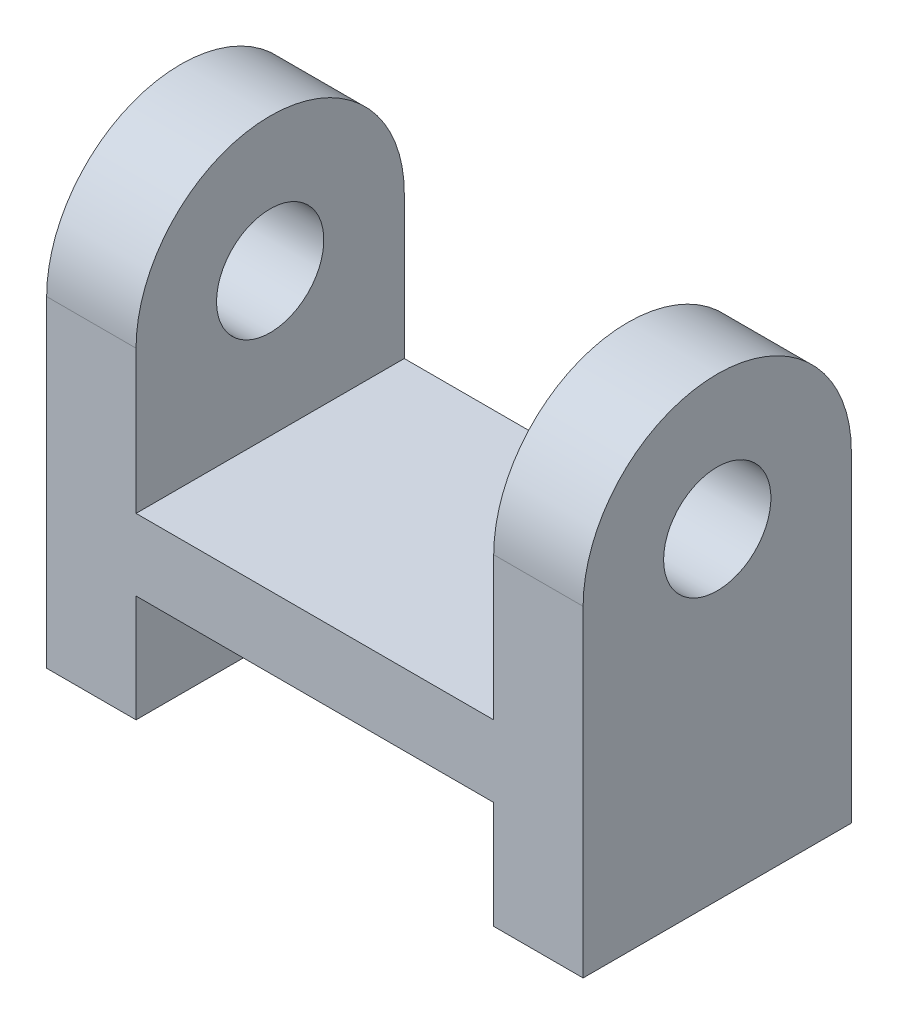
ISO-10303-21;
HEADER;
FILE_DESCRIPTION(('STEP AP214'),'2;1');
FILE_NAME('part.step','',(''),(''),'','','');
FILE_SCHEMA(('AUTOMOTIVE_DESIGN { 1 0 10303 214 1 1 1 1 }'));
ENDSEC;
DATA;
#1=APPLICATION_CONTEXT('core data for automotive mechanical design processes');
#2=APPLICATION_PROTOCOL_DEFINITION('international standard','automotive_design',2000,#1);
#3=PRODUCT_CONTEXT('',#1,'mechanical');
#4=PRODUCT('Part','Part','',(#3));
#5=PRODUCT_RELATED_PRODUCT_CATEGORY('part','',(#4));
#6=PRODUCT_DEFINITION_FORMATION('','',#4);
#7=PRODUCT_DEFINITION_CONTEXT('part definition',#1,'design');
#8=PRODUCT_DEFINITION('design','',#6,#7);
#9=PRODUCT_DEFINITION_SHAPE('','',#8);
#10=(LENGTH_UNIT() NAMED_UNIT(*) SI_UNIT(.MILLI.,.METRE.));
#11=(NAMED_UNIT(*) PLANE_ANGLE_UNIT() SI_UNIT($,.RADIAN.));
#12=(NAMED_UNIT(*) SI_UNIT($,.STERADIAN.) SOLID_ANGLE_UNIT());
#13=UNCERTAINTY_MEASURE_WITH_UNIT(LENGTH_MEASURE(1.E-05),#10,'distance_accuracy_value','');
#14=(GEOMETRIC_REPRESENTATION_CONTEXT(3) GLOBAL_UNCERTAINTY_ASSIGNED_CONTEXT((#13)) GLOBAL_UNIT_ASSIGNED_CONTEXT((#10,
#11,#12)) REPRESENTATION_CONTEXT('',''));
#15=CARTESIAN_POINT('',(0.,0.,0.));
#16=DIRECTION('',(0.,0.,1.));
#17=DIRECTION('',(1.,0.,0.));
#18=AXIS2_PLACEMENT_3D('',#15,#16,#17);
#19=CARTESIAN_POINT('',(10.,0.,15.));
#20=DIRECTION('',(0.,1.,0.));
#21=DIRECTION('',(-1.,0.,0.));
#22=AXIS2_PLACEMENT_3D('',#19,#20,#21);
#23=PLANE('',#22);
#24=DIRECTION('',(1.,0.,0.));
#25=VECTOR('',#24,1.);
#26=CARTESIAN_POINT('',(10.,0.,0.));
#27=LINE('',#26,#25);
#28=CARTESIAN_POINT('',(10.,0.,0.));
#29=VERTEX_POINT('',#28);
#30=CARTESIAN_POINT('',(15.,0.,0.));
#31=VERTEX_POINT('',#30);
#32=EDGE_CURVE('E201',#29,#31,#27,.T.);
#33=ORIENTED_EDGE('',*,*,#32,.T.);
#34=DIRECTION('',(0.,0.,-1.));
#35=VECTOR('',#34,1.);
#36=CARTESIAN_POINT('',(15.,0.,15.));
#37=LINE('',#36,#35);
#38=CARTESIAN_POINT('',(15.,0.,15.));
#39=VERTEX_POINT('',#38);
#40=EDGE_CURVE('E11',#39,#31,#37,.T.);
#41=ORIENTED_EDGE('',*,*,#40,.F.);
#42=DIRECTION('',(1.,0.,0.));
#43=VECTOR('',#42,1.);
#44=CARTESIAN_POINT('',(10.,0.,15.));
#45=LINE('',#44,#43);
#46=CARTESIAN_POINT('',(10.,0.,15.));
#47=VERTEX_POINT('',#46);
#48=EDGE_CURVE('E205',#47,#39,#45,.T.);
#49=ORIENTED_EDGE('',*,*,#48,.F.);
#50=DIRECTION('',(0.,0.,-1.));
#51=VECTOR('',#50,1.);
#52=CARTESIAN_POINT('',(10.,0.,15.));
#53=LINE('',#52,#51);
#54=EDGE_CURVE('E230',#47,#29,#53,.T.);
#55=ORIENTED_EDGE('',*,*,#54,.T.);
#56=EDGE_LOOP('',(#33,#41,#49,#55));
#57=FACE_BOUND('',#56,.T.);
#58=ADVANCED_FACE('F39',(#57),#23,.F.);
#59=CARTESIAN_POINT('',(15.,0.,15.));
#60=DIRECTION('',(-1.,0.,0.));
#61=DIRECTION('',(0.,0.,1.));
#62=AXIS2_PLACEMENT_3D('',#59,#60,#61);
#63=PLANE('',#62);
#64=CARTESIAN_POINT('',(15.,18.,7.5));
#65=DIRECTION('',(-1.,0.,0.));
#66=DIRECTION('',(0.,0.,1.));
#67=AXIS2_PLACEMENT_3D('',#64,#65,#66);
#68=CIRCLE('',#67,3.);
#69=CARTESIAN_POINT('',(15.,18.,10.5));
#70=VERTEX_POINT('',#69);
#71=EDGE_CURVE('E336',#70,#70,#68,.T.);
#72=ORIENTED_EDGE('',*,*,#71,.T.);
#73=EDGE_LOOP('',(#72));
#74=FACE_BOUND('',#73,.T.);
#75=DIRECTION('',(0.,1.,0.));
#76=VECTOR('',#75,1.);
#77=CARTESIAN_POINT('',(15.,0.,0.));
#78=LINE('',#77,#76);
#79=CARTESIAN_POINT('',(15.,18.,0.));
#80=VERTEX_POINT('',#79);
#81=EDGE_CURVE('E139',#31,#80,#78,.T.);
#82=ORIENTED_EDGE('',*,*,#81,.T.);
#83=CARTESIAN_POINT('',(15.,18.,7.5));
#84=DIRECTION('',(-1.,0.,0.));
#85=DIRECTION('',(0.,0.,-1.));
#86=AXIS2_PLACEMENT_3D('',#83,#84,#85);
#87=CIRCLE('',#86,7.5);
#88=CARTESIAN_POINT('',(15.,18.,15.));
#89=VERTEX_POINT('',#88);
#90=EDGE_CURVE('E146',#89,#80,#87,.T.);
#91=ORIENTED_EDGE('',*,*,#90,.F.);
#92=DIRECTION('',(0.,1.,0.));
#93=VECTOR('',#92,1.);
#94=CARTESIAN_POINT('',(15.,0.,15.));
#95=LINE('',#94,#93);
#96=EDGE_CURVE('E209',#39,#89,#95,.T.);
#97=ORIENTED_EDGE('',*,*,#96,.F.);
#98=ORIENTED_EDGE('',*,*,#40,.T.);
#99=EDGE_LOOP('',(#82,#91,#97,#98));
#100=FACE_BOUND('',#99,.T.);
#101=ADVANCED_FACE('F306',(#74,#100),#63,.F.);
#102=CARTESIAN_POINT('',(-15.,10.,15.));
#103=DIRECTION('',(0.,-1.,0.));
#104=DIRECTION('',(0.,0.,-1.));
#105=AXIS2_PLACEMENT_3D('',#102,#103,#104);
#106=PLANE('',#105);
#107=DIRECTION('',(-1.,0.,0.));
#108=VECTOR('',#107,1.);
#109=CARTESIAN_POINT('',(-15.,10.,15.));
#110=LINE('',#109,#108);
#111=CARTESIAN_POINT('',(9.99999999999999,10.,15.));
#112=VERTEX_POINT('',#111);
#113=CARTESIAN_POINT('',(-10.,10.,15.));
#114=VERTEX_POINT('',#113);
#115=EDGE_CURVE('E54',#112,#114,#110,.T.);
#116=ORIENTED_EDGE('',*,*,#115,.F.);
#117=DIRECTION('',(0.,0.,1.));
#118=VECTOR('',#117,1.);
#119=CARTESIAN_POINT('',(9.99999999999999,10.,0.));
#120=LINE('',#119,#118);
#121=CARTESIAN_POINT('',(9.99999999999999,10.,0.));
#122=VERTEX_POINT('',#121);
#123=EDGE_CURVE('E142',#122,#112,#120,.T.);
#124=ORIENTED_EDGE('',*,*,#123,.F.);
#125=DIRECTION('',(-1.,0.,0.));
#126=VECTOR('',#125,1.);
#127=CARTESIAN_POINT('',(-15.,10.,0.));
#128=LINE('',#127,#126);
#129=CARTESIAN_POINT('',(-10.,10.,0.));
#130=VERTEX_POINT('',#129);
#131=EDGE_CURVE('E128',#122,#130,#128,.T.);
#132=ORIENTED_EDGE('',*,*,#131,.T.);
#133=DIRECTION('',(0.,0.,1.));
#134=VECTOR('',#133,1.);
#135=CARTESIAN_POINT('',(-10.,10.,0.));
#136=LINE('',#135,#134);
#137=EDGE_CURVE('E181',#130,#114,#136,.T.);
#138=ORIENTED_EDGE('',*,*,#137,.T.);
#139=EDGE_LOOP('',(#116,#124,#132,#138));
#140=FACE_BOUND('',#139,.T.);
#141=ADVANCED_FACE('F143',(#140),#106,.F.);
#142=CARTESIAN_POINT('',(-15.,0.,15.));
#143=DIRECTION('',(1.,0.,0.));
#144=DIRECTION('',(0.,0.,-1.));
#145=AXIS2_PLACEMENT_3D('',#142,#143,#144);
#146=PLANE('',#145);
#147=CARTESIAN_POINT('',(-15.,18.,7.5));
#148=DIRECTION('',(-1.,0.,0.));
#149=DIRECTION('',(0.,0.,1.));
#150=AXIS2_PLACEMENT_3D('',#147,#148,#149);
#151=CIRCLE('',#150,3.);
#152=CARTESIAN_POINT('',(-15.,18.,10.5));
#153=VERTEX_POINT('',#152);
#154=EDGE_CURVE('E170',#153,#153,#151,.T.);
#155=ORIENTED_EDGE('',*,*,#154,.F.);
#156=EDGE_LOOP('',(#155));
#157=FACE_BOUND('',#156,.T.);
#158=DIRECTION('',(0.,-1.,0.));
#159=VECTOR('',#158,1.);
#160=CARTESIAN_POINT('',(-15.,0.,0.));
#161=LINE('',#160,#159);
#162=CARTESIAN_POINT('',(-15.,18.,0.));
#163=VERTEX_POINT('',#162);
#164=CARTESIAN_POINT('',(-15.,0.,0.));
#165=VERTEX_POINT('',#164);
#166=EDGE_CURVE('E138',#163,#165,#161,.T.);
#167=ORIENTED_EDGE('',*,*,#166,.T.);
#168=DIRECTION('',(0.,0.,-1.));
#169=VECTOR('',#168,1.);
#170=CARTESIAN_POINT('',(-15.,0.,15.));
#171=LINE('',#170,#169);
#172=CARTESIAN_POINT('',(-15.,0.,15.));
#173=VERTEX_POINT('',#172);
#174=EDGE_CURVE('E47',#173,#165,#171,.T.);
#175=ORIENTED_EDGE('',*,*,#174,.F.);
#176=DIRECTION('',(0.,-1.,0.));
#177=VECTOR('',#176,1.);
#178=CARTESIAN_POINT('',(-15.,0.,15.));
#179=LINE('',#178,#177);
#180=CARTESIAN_POINT('',(-15.,18.,15.));
#181=VERTEX_POINT('',#180);
#182=EDGE_CURVE('E215',#181,#173,#179,.T.);
#183=ORIENTED_EDGE('',*,*,#182,.F.);
#184=CARTESIAN_POINT('',(-15.,18.,7.5));
#185=DIRECTION('',(-1.,0.,0.));
#186=DIRECTION('',(0.,0.,-1.));
#187=AXIS2_PLACEMENT_3D('',#184,#185,#186);
#188=CIRCLE('',#187,7.5);
#189=EDGE_CURVE('E177',#181,#163,#188,.T.);
#190=ORIENTED_EDGE('',*,*,#189,.T.);
#191=EDGE_LOOP('',(#167,#175,#183,#190));
#192=FACE_BOUND('',#191,.T.);
#193=ADVANCED_FACE('F287',(#157,#192),#146,.F.);
#194=CARTESIAN_POINT('',(-10.,0.,15.));
#195=DIRECTION('',(0.,1.,0.));
#196=DIRECTION('',(-1.,0.,0.));
#197=AXIS2_PLACEMENT_3D('',#194,#195,#196);
#198=PLANE('',#197);
#199=DIRECTION('',(1.,0.,0.));
#200=VECTOR('',#199,1.);
#201=CARTESIAN_POINT('',(-10.,0.,0.));
#202=LINE('',#201,#200);
#203=CARTESIAN_POINT('',(-10.,0.,0.));
#204=VERTEX_POINT('',#203);
#205=EDGE_CURVE('E238',#165,#204,#202,.T.);
#206=ORIENTED_EDGE('',*,*,#205,.T.);
#207=DIRECTION('',(0.,0.,-1.));
#208=VECTOR('',#207,1.);
#209=CARTESIAN_POINT('',(-10.,0.,15.));
#210=LINE('',#209,#208);
#211=CARTESIAN_POINT('',(-10.,0.,15.));
#212=VERTEX_POINT('',#211);
#213=EDGE_CURVE('E260',#212,#204,#210,.T.);
#214=ORIENTED_EDGE('',*,*,#213,.F.);
#215=DIRECTION('',(1.,0.,0.));
#216=VECTOR('',#215,1.);
#217=CARTESIAN_POINT('',(-10.,0.,15.));
#218=LINE('',#217,#216);
#219=EDGE_CURVE('E218',#173,#212,#218,.T.);
#220=ORIENTED_EDGE('',*,*,#219,.F.);
#221=ORIENTED_EDGE('',*,*,#174,.T.);
#222=EDGE_LOOP('',(#206,#214,#220,#221));
#223=FACE_BOUND('',#222,.T.);
#224=ADVANCED_FACE('F269',(#223),#198,.F.);
#225=CARTESIAN_POINT('',(-10.,6.,15.));
#226=DIRECTION('',(-1.,0.,0.));
#227=DIRECTION('',(0.,0.,1.));
#228=AXIS2_PLACEMENT_3D('',#225,#226,#227);
#229=PLANE('',#228);
#230=DIRECTION('',(0.,1.,0.));
#231=VECTOR('',#230,1.);
#232=CARTESIAN_POINT('',(-10.,6.,0.));
#233=LINE('',#232,#231);
#234=CARTESIAN_POINT('',(-10.,6.,0.));
#235=VERTEX_POINT('',#234);
#236=EDGE_CURVE('E241',#204,#235,#233,.T.);
#237=ORIENTED_EDGE('',*,*,#236,.T.);
#238=DIRECTION('',(0.,0.,-1.));
#239=VECTOR('',#238,1.);
#240=CARTESIAN_POINT('',(-10.,6.,15.));
#241=LINE('',#240,#239);
#242=CARTESIAN_POINT('',(-10.,6.,15.));
#243=VERTEX_POINT('',#242);
#244=EDGE_CURVE('E256',#243,#235,#241,.T.);
#245=ORIENTED_EDGE('',*,*,#244,.F.);
#246=DIRECTION('',(0.,1.,0.));
#247=VECTOR('',#246,1.);
#248=CARTESIAN_POINT('',(-10.,6.,15.));
#249=LINE('',#248,#247);
#250=EDGE_CURVE('E221',#212,#243,#249,.T.);
#251=ORIENTED_EDGE('',*,*,#250,.F.);
#252=ORIENTED_EDGE('',*,*,#213,.T.);
#253=EDGE_LOOP('',(#237,#245,#251,#252));
#254=FACE_BOUND('',#253,.T.);
#255=ADVANCED_FACE('F277',(#254),#229,.F.);
#256=CARTESIAN_POINT('',(10.,6.,15.));
#257=DIRECTION('',(0.,1.,0.));
#258=DIRECTION('',(0.,0.,1.));
#259=AXIS2_PLACEMENT_3D('',#256,#257,#258);
#260=PLANE('',#259);
#261=DIRECTION('',(1.,0.,0.));
#262=VECTOR('',#261,1.);
#263=CARTESIAN_POINT('',(10.,6.,0.));
#264=LINE('',#263,#262);
#265=CARTESIAN_POINT('',(10.,6.,0.));
#266=VERTEX_POINT('',#265);
#267=EDGE_CURVE('E244',#235,#266,#264,.T.);
#268=ORIENTED_EDGE('',*,*,#267,.T.);
#269=DIRECTION('',(0.,0.,-1.));
#270=VECTOR('',#269,1.);
#271=CARTESIAN_POINT('',(10.,6.,15.));
#272=LINE('',#271,#270);
#273=CARTESIAN_POINT('',(10.,6.,15.));
#274=VERTEX_POINT('',#273);
#275=EDGE_CURVE('E252',#274,#266,#272,.T.);
#276=ORIENTED_EDGE('',*,*,#275,.F.);
#277=DIRECTION('',(1.,0.,0.));
#278=VECTOR('',#277,1.);
#279=CARTESIAN_POINT('',(10.,6.,15.));
#280=LINE('',#279,#278);
#281=EDGE_CURVE('E224',#243,#274,#280,.T.);
#282=ORIENTED_EDGE('',*,*,#281,.F.);
#283=ORIENTED_EDGE('',*,*,#244,.T.);
#284=EDGE_LOOP('',(#268,#276,#282,#283));
#285=FACE_BOUND('',#284,.T.);
#286=ADVANCED_FACE('F281',(#285),#260,.F.);
#287=CARTESIAN_POINT('',(10.,6.,15.));
#288=DIRECTION('',(1.,0.,0.));
#289=DIRECTION('',(0.,1.,0.));
#290=AXIS2_PLACEMENT_3D('',#287,#288,#289);
#291=PLANE('',#290);
#292=DIRECTION('',(0.,-1.,0.));
#293=VECTOR('',#292,1.);
#294=CARTESIAN_POINT('',(10.,6.,0.));
#295=LINE('',#294,#293);
#296=EDGE_CURVE('E210',#266,#29,#295,.T.);
#297=ORIENTED_EDGE('',*,*,#296,.T.);
#298=ORIENTED_EDGE('',*,*,#54,.F.);
#299=DIRECTION('',(0.,-1.,0.));
#300=VECTOR('',#299,1.);
#301=CARTESIAN_POINT('',(10.,6.,15.));
#302=LINE('',#301,#300);
#303=EDGE_CURVE('E227',#274,#47,#302,.T.);
#304=ORIENTED_EDGE('',*,*,#303,.F.);
#305=ORIENTED_EDGE('',*,*,#275,.T.);
#306=EDGE_LOOP('',(#297,#298,#304,#305));
#307=FACE_BOUND('',#306,.T.);
#308=ADVANCED_FACE('F366',(#307),#291,.F.);
#309=CARTESIAN_POINT('',(0.,0.,15.));
#310=DIRECTION('',(0.,0.,1.));
#311=DIRECTION('',(1.,0.,0.));
#312=AXIS2_PLACEMENT_3D('',#309,#310,#311);
#313=PLANE('',#312);
#314=ORIENTED_EDGE('',*,*,#48,.T.);
#315=ORIENTED_EDGE('',*,*,#96,.T.);
#316=DIRECTION('',(1.,0.,0.));
#317=VECTOR('',#316,1.);
#318=CARTESIAN_POINT('',(9.99999999999999,18.,15.));
#319=LINE('',#318,#317);
#320=CARTESIAN_POINT('',(9.99999999999999,18.,15.));
#321=VERTEX_POINT('',#320);
#322=EDGE_CURVE('E166',#321,#89,#319,.T.);
#323=ORIENTED_EDGE('',*,*,#322,.F.);
#324=DIRECTION('',(0.,1.,0.));
#325=VECTOR('',#324,1.);
#326=CARTESIAN_POINT('',(9.99999999999999,18.,15.));
#327=LINE('',#326,#325);
#328=EDGE_CURVE('E155',#112,#321,#327,.T.);
#329=ORIENTED_EDGE('',*,*,#328,.F.);
#330=ORIENTED_EDGE('',*,*,#115,.T.);
#331=DIRECTION('',(0.,1.,0.));
#332=VECTOR('',#331,1.);
#333=CARTESIAN_POINT('',(-10.,18.,15.));
#334=LINE('',#333,#332);
#335=CARTESIAN_POINT('',(-10.,18.,15.));
#336=VERTEX_POINT('',#335);
#337=EDGE_CURVE('E184',#114,#336,#334,.T.);
#338=ORIENTED_EDGE('',*,*,#337,.T.);
#339=DIRECTION('',(-1.,0.,0.));
#340=VECTOR('',#339,1.);
#341=CARTESIAN_POINT('',(-10.,18.,15.));
#342=LINE('',#341,#340);
#343=EDGE_CURVE('E193',#336,#181,#342,.T.);
#344=ORIENTED_EDGE('',*,*,#343,.T.);
#345=ORIENTED_EDGE('',*,*,#182,.T.);
#346=ORIENTED_EDGE('',*,*,#219,.T.);
#347=ORIENTED_EDGE('',*,*,#250,.T.);
#348=ORIENTED_EDGE('',*,*,#281,.T.);
#349=ORIENTED_EDGE('',*,*,#303,.T.);
#350=EDGE_LOOP('',(#314,#315,#323,#329,#330,#338,#344,#345,#346,#347,#348,#349));
#351=FACE_BOUND('',#350,.T.);
#352=ADVANCED_FACE('F284',(#351),#313,.T.);
#353=CARTESIAN_POINT('',(0.,0.,0.));
#354=DIRECTION('',(0.,0.,1.));
#355=DIRECTION('',(1.,0.,0.));
#356=AXIS2_PLACEMENT_3D('',#353,#354,#355);
#357=PLANE('',#356);
#358=ORIENTED_EDGE('',*,*,#32,.F.);
#359=ORIENTED_EDGE('',*,*,#296,.F.);
#360=ORIENTED_EDGE('',*,*,#267,.F.);
#361=ORIENTED_EDGE('',*,*,#236,.F.);
#362=ORIENTED_EDGE('',*,*,#205,.F.);
#363=ORIENTED_EDGE('',*,*,#166,.F.);
#364=DIRECTION('',(-1.,0.,0.));
#365=VECTOR('',#364,1.);
#366=CARTESIAN_POINT('',(-10.,18.,0.));
#367=LINE('',#366,#365);
#368=CARTESIAN_POINT('',(-10.,18.,0.));
#369=VERTEX_POINT('',#368);
#370=EDGE_CURVE('E197',#369,#163,#367,.T.);
#371=ORIENTED_EDGE('',*,*,#370,.F.);
#372=DIRECTION('',(0.,-1.,0.));
#373=VECTOR('',#372,1.);
#374=CARTESIAN_POINT('',(-10.,10.,0.));
#375=LINE('',#374,#373);
#376=EDGE_CURVE('E135',#369,#130,#375,.T.);
#377=ORIENTED_EDGE('',*,*,#376,.T.);
#378=ORIENTED_EDGE('',*,*,#131,.F.);
#379=DIRECTION('',(0.,-1.,0.));
#380=VECTOR('',#379,1.);
#381=CARTESIAN_POINT('',(9.99999999999999,10.,0.));
#382=LINE('',#381,#380);
#383=CARTESIAN_POINT('',(9.99999999999999,18.,0.));
#384=VERTEX_POINT('',#383);
#385=EDGE_CURVE('E133',#384,#122,#382,.T.);
#386=ORIENTED_EDGE('',*,*,#385,.F.);
#387=DIRECTION('',(1.,0.,0.));
#388=VECTOR('',#387,1.);
#389=CARTESIAN_POINT('',(9.99999999999999,18.,0.));
#390=LINE('',#389,#388);
#391=EDGE_CURVE('E161',#384,#80,#390,.T.);
#392=ORIENTED_EDGE('',*,*,#391,.T.);
#393=ORIENTED_EDGE('',*,*,#81,.F.);
#394=EDGE_LOOP('',(#358,#359,#360,#361,#362,#363,#371,#377,#378,#386,#392,#393));
#395=FACE_BOUND('',#394,.T.);
#396=ADVANCED_FACE('F130',(#395),#357,.F.);
#397=CARTESIAN_POINT('',(-10.,18.,7.5));
#398=DIRECTION('',(-1.,0.,0.));
#399=DIRECTION('',(0.,0.,1.));
#400=AXIS2_PLACEMENT_3D('',#397,#398,#399);
#401=CYLINDRICAL_SURFACE('',#400,7.5);
#402=ORIENTED_EDGE('',*,*,#189,.F.);
#403=ORIENTED_EDGE('',*,*,#343,.F.);
#404=CARTESIAN_POINT('',(-10.,18.,7.5));
#405=DIRECTION('',(-1.,0.,0.));
#406=DIRECTION('',(0.,0.,-1.));
#407=AXIS2_PLACEMENT_3D('',#404,#405,#406);
#408=CIRCLE('',#407,7.5);
#409=EDGE_CURVE('E187',#336,#369,#408,.T.);
#410=ORIENTED_EDGE('',*,*,#409,.T.);
#411=ORIENTED_EDGE('',*,*,#370,.T.);
#412=EDGE_LOOP('',(#402,#403,#410,#411));
#413=FACE_BOUND('',#412,.T.);
#414=ADVANCED_FACE('F289',(#413),#401,.T.);
#415=CARTESIAN_POINT('',(-10.,18.,7.5));
#416=DIRECTION('',(1.,0.,0.));
#417=DIRECTION('',(0.,0.,-1.));
#418=AXIS2_PLACEMENT_3D('',#415,#416,#417);
#419=PLANE('',#418);
#420=CARTESIAN_POINT('',(-10.,18.,7.5));
#421=DIRECTION('',(-1.,0.,0.));
#422=DIRECTION('',(0.,0.,1.));
#423=AXIS2_PLACEMENT_3D('',#420,#421,#422);
#424=CIRCLE('',#423,3.);
#425=CARTESIAN_POINT('',(-10.,18.,10.5));
#426=VERTEX_POINT('',#425);
#427=EDGE_CURVE('E173',#426,#426,#424,.T.);
#428=ORIENTED_EDGE('',*,*,#427,.T.);
#429=EDGE_LOOP('',(#428));
#430=FACE_BOUND('',#429,.T.);
#431=ORIENTED_EDGE('',*,*,#137,.F.);
#432=ORIENTED_EDGE('',*,*,#376,.F.);
#433=ORIENTED_EDGE('',*,*,#409,.F.);
#434=ORIENTED_EDGE('',*,*,#337,.F.);
#435=EDGE_LOOP('',(#431,#432,#433,#434));
#436=FACE_BOUND('',#435,.T.);
#437=ADVANCED_FACE('F292',(#430,#436),#419,.T.);
#438=CARTESIAN_POINT('',(-10.,18.,7.5));
#439=DIRECTION('',(-1.,0.,0.));
#440=DIRECTION('',(0.,0.,1.));
#441=AXIS2_PLACEMENT_3D('',#438,#439,#440);
#442=CYLINDRICAL_SURFACE('',#441,3.);
#443=ORIENTED_EDGE('',*,*,#427,.F.);
#444=EDGE_LOOP('',(#443));
#445=FACE_BOUND('',#444,.T.);
#446=ORIENTED_EDGE('',*,*,#154,.T.);
#447=EDGE_LOOP('',(#446));
#448=FACE_BOUND('',#447,.T.);
#449=ADVANCED_FACE('F294',(#445,#448),#442,.F.);
#450=CARTESIAN_POINT('',(9.99999999999999,18.,7.5));
#451=DIRECTION('',(1.,0.,0.));
#452=DIRECTION('',(0.,1.,0.));
#453=AXIS2_PLACEMENT_3D('',#450,#451,#452);
#454=CYLINDRICAL_SURFACE('',#453,7.5);
#455=ORIENTED_EDGE('',*,*,#90,.T.);
#456=ORIENTED_EDGE('',*,*,#391,.F.);
#457=CARTESIAN_POINT('',(9.99999999999999,18.,7.5));
#458=DIRECTION('',(-1.,0.,0.));
#459=DIRECTION('',(0.,0.,-1.));
#460=AXIS2_PLACEMENT_3D('',#457,#458,#459);
#461=CIRCLE('',#460,7.5);
#462=EDGE_CURVE('E150',#321,#384,#461,.T.);
#463=ORIENTED_EDGE('',*,*,#462,.F.);
#464=ORIENTED_EDGE('',*,*,#322,.T.);
#465=EDGE_LOOP('',(#455,#456,#463,#464));
#466=FACE_BOUND('',#465,.T.);
#467=ADVANCED_FACE('F301',(#466),#454,.T.);
#468=CARTESIAN_POINT('',(9.99999999999999,18.,7.5));
#469=DIRECTION('',(-1.,0.,0.));
#470=DIRECTION('',(0.,0.,-1.));
#471=AXIS2_PLACEMENT_3D('',#468,#469,#470);
#472=PLANE('',#471);
#473=CARTESIAN_POINT('',(9.99999999999999,18.,7.5));
#474=DIRECTION('',(-1.,0.,0.));
#475=DIRECTION('',(0.,0.,1.));
#476=AXIS2_PLACEMENT_3D('',#473,#474,#475);
#477=CIRCLE('',#476,3.);
#478=CARTESIAN_POINT('',(9.99999999999999,18.,10.5));
#479=VERTEX_POINT('',#478);
#480=EDGE_CURVE('E165',#479,#479,#477,.T.);
#481=ORIENTED_EDGE('',*,*,#480,.F.);
#482=EDGE_LOOP('',(#481));
#483=FACE_BOUND('',#482,.T.);
#484=ORIENTED_EDGE('',*,*,#123,.T.);
#485=ORIENTED_EDGE('',*,*,#328,.T.);
#486=ORIENTED_EDGE('',*,*,#462,.T.);
#487=ORIENTED_EDGE('',*,*,#385,.T.);
#488=EDGE_LOOP('',(#484,#485,#486,#487));
#489=FACE_BOUND('',#488,.T.);
#490=ADVANCED_FACE('F148',(#483,#489),#472,.T.);
#491=CARTESIAN_POINT('',(9.99999999999999,18.,7.5));
#492=DIRECTION('',(1.,0.,0.));
#493=DIRECTION('',(0.,1.,0.));
#494=AXIS2_PLACEMENT_3D('',#491,#492,#493);
#495=CYLINDRICAL_SURFACE('',#494,3.);
#496=ORIENTED_EDGE('',*,*,#480,.T.);
#497=EDGE_LOOP('',(#496));
#498=FACE_BOUND('',#497,.T.);
#499=ORIENTED_EDGE('',*,*,#71,.F.);
#500=EDGE_LOOP('',(#499));
#501=FACE_BOUND('',#500,.T.);
#502=ADVANCED_FACE('F323',(#498,#501),#495,.F.);
#503=CLOSED_SHELL('',(#58,#101,#141,#193,#224,#255,#286,#308,#352,#396,#414,#437,#449,#467,#490,#502));
#504=MANIFOLD_SOLID_BREP('B2',#503);
#505=ADVANCED_BREP_SHAPE_REPRESENTATION('',(#18,#504),#14);
#506=SHAPE_DEFINITION_REPRESENTATION(#9,#505);
ENDSEC;
END-ISO-10303-21;
